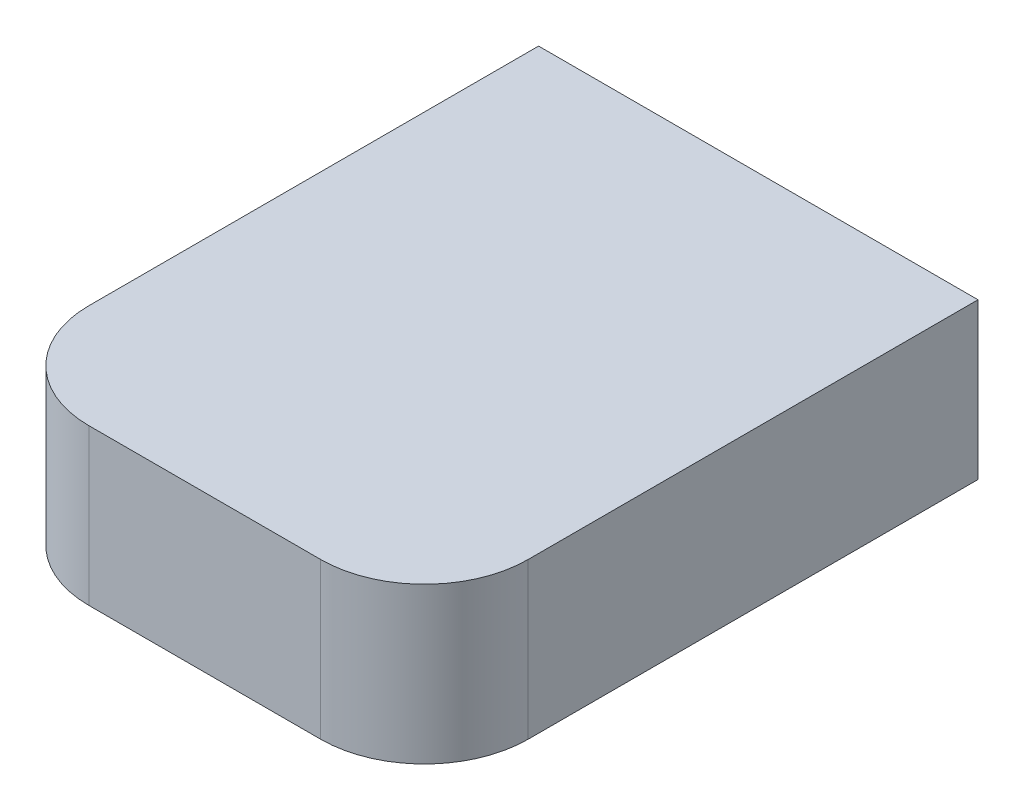
ISO-10303-21;
HEADER;
FILE_DESCRIPTION(('STEP AP214'),'2;1');
FILE_NAME('part.step','',(''),(''),'','','');
FILE_SCHEMA(('AUTOMOTIVE_DESIGN { 1 0 10303 214 1 1 1 1 }'));
ENDSEC;
DATA;
#1=APPLICATION_CONTEXT('core data for automotive mechanical design processes');
#2=APPLICATION_PROTOCOL_DEFINITION('international standard','automotive_design',2000,#1);
#3=PRODUCT_CONTEXT('',#1,'mechanical');
#4=PRODUCT('Part','Part','',(#3));
#5=PRODUCT_RELATED_PRODUCT_CATEGORY('part','',(#4));
#6=PRODUCT_DEFINITION_FORMATION('','',#4);
#7=PRODUCT_DEFINITION_CONTEXT('part definition',#1,'design');
#8=PRODUCT_DEFINITION('design','',#6,#7);
#9=PRODUCT_DEFINITION_SHAPE('','',#8);
#10=(LENGTH_UNIT() NAMED_UNIT(*) SI_UNIT(.MILLI.,.METRE.));
#11=(NAMED_UNIT(*) PLANE_ANGLE_UNIT() SI_UNIT($,.RADIAN.));
#12=(NAMED_UNIT(*) SI_UNIT($,.STERADIAN.) SOLID_ANGLE_UNIT());
#13=UNCERTAINTY_MEASURE_WITH_UNIT(LENGTH_MEASURE(1.E-05),#10,'distance_accuracy_value','');
#14=(GEOMETRIC_REPRESENTATION_CONTEXT(3) GLOBAL_UNCERTAINTY_ASSIGNED_CONTEXT((#13)) GLOBAL_UNIT_ASSIGNED_CONTEXT((#10,
#11,#12)) REPRESENTATION_CONTEXT('',''));
#15=CARTESIAN_POINT('',(0.,0.,0.));
#16=DIRECTION('',(0.,0.,1.));
#17=DIRECTION('',(1.,0.,0.));
#18=AXIS2_PLACEMENT_3D('',#15,#16,#17);
#19=CARTESIAN_POINT('',(129.05,-4.5,16.));
#20=DIRECTION('',(-1.,0.,0.));
#21=DIRECTION('',(0.,0.,1.));
#22=AXIS2_PLACEMENT_3D('',#19,#20,#21);
#23=PLANE('',#22);
#24=DIRECTION('',(0.,0.,-1.));
#25=VECTOR('',#24,1.);
#26=CARTESIAN_POINT('',(129.05,0.,16.));
#27=LINE('',#26,#25);
#28=CARTESIAN_POINT('',(129.05,0.,13.));
#29=VERTEX_POINT('',#28);
#30=CARTESIAN_POINT('',(129.05,0.,0.));
#31=VERTEX_POINT('',#30);
#32=EDGE_CURVE('E84',#29,#31,#27,.T.);
#33=ORIENTED_EDGE('',*,*,#32,.F.);
#34=DIRECTION('',(0.,1.,0.));
#35=VECTOR('',#34,1.);
#36=CARTESIAN_POINT('',(129.05,-4.5,13.));
#37=LINE('',#36,#35);
#38=CARTESIAN_POINT('',(129.05,-4.5,13.));
#39=VERTEX_POINT('',#38);
#40=EDGE_CURVE('E124',#29,#39,#37,.F.);
#41=ORIENTED_EDGE('',*,*,#40,.T.);
#42=DIRECTION('',(0.,0.,-1.));
#43=VECTOR('',#42,1.);
#44=CARTESIAN_POINT('',(129.05,-4.5,16.));
#45=LINE('',#44,#43);
#46=CARTESIAN_POINT('',(129.05,-4.5,0.));
#47=VERTEX_POINT('',#46);
#48=EDGE_CURVE('E106',#39,#47,#45,.T.);
#49=ORIENTED_EDGE('',*,*,#48,.T.);
#50=DIRECTION('',(0.,1.,0.));
#51=VECTOR('',#50,1.);
#52=CARTESIAN_POINT('',(129.05,-4.5,0.));
#53=LINE('',#52,#51);
#54=EDGE_CURVE('E101',#47,#31,#53,.T.);
#55=ORIENTED_EDGE('',*,*,#54,.T.);
#56=EDGE_LOOP('',(#33,#41,#49,#55));
#57=FACE_BOUND('',#56,.T.);
#58=ADVANCED_FACE('F33',(#57),#23,.F.);
#59=CARTESIAN_POINT('',(129.05,0.,16.));
#60=DIRECTION('',(0.,-1.,0.));
#61=DIRECTION('',(1.,0.,0.));
#62=AXIS2_PLACEMENT_3D('',#59,#60,#61);
#63=PLANE('',#62);
#64=DIRECTION('',(0.,0.,-1.));
#65=VECTOR('',#64,1.);
#66=CARTESIAN_POINT('',(116.35,0.,16.));
#67=LINE('',#66,#65);
#68=CARTESIAN_POINT('',(116.35,0.,13.));
#69=VERTEX_POINT('',#68);
#70=CARTESIAN_POINT('',(116.35,0.,0.));
#71=VERTEX_POINT('',#70);
#72=EDGE_CURVE('E95',#69,#71,#67,.T.);
#73=ORIENTED_EDGE('',*,*,#72,.F.);
#74=CARTESIAN_POINT('',(119.35,0.,13.));
#75=DIRECTION('',(0.,-1.,0.));
#76=DIRECTION('',(1.,0.,0.));
#77=AXIS2_PLACEMENT_3D('',#74,#75,#76);
#78=CIRCLE('',#77,3.);
#79=CARTESIAN_POINT('',(119.35,0.,16.));
#80=VERTEX_POINT('',#79);
#81=EDGE_CURVE('E11',#69,#80,#78,.F.);
#82=ORIENTED_EDGE('',*,*,#81,.T.);
#83=DIRECTION('',(-1.,0.,0.));
#84=VECTOR('',#83,1.);
#85=CARTESIAN_POINT('',(129.05,0.,16.));
#86=LINE('',#85,#84);
#87=CARTESIAN_POINT('',(126.05,0.,16.));
#88=VERTEX_POINT('',#87);
#89=EDGE_CURVE('E116',#88,#80,#86,.T.);
#90=ORIENTED_EDGE('',*,*,#89,.F.);
#91=CARTESIAN_POINT('',(126.05,0.,13.));
#92=DIRECTION('',(0.,-1.,0.));
#93=DIRECTION('',(1.,0.,0.));
#94=AXIS2_PLACEMENT_3D('',#91,#92,#93);
#95=CIRCLE('',#94,3.);
#96=EDGE_CURVE('E90',#88,#29,#95,.F.);
#97=ORIENTED_EDGE('',*,*,#96,.T.);
#98=ORIENTED_EDGE('',*,*,#32,.T.);
#99=DIRECTION('',(-1.,0.,0.));
#100=VECTOR('',#99,1.);
#101=CARTESIAN_POINT('',(129.05,0.,0.));
#102=LINE('',#101,#100);
#103=EDGE_CURVE('E87',#31,#71,#102,.T.);
#104=ORIENTED_EDGE('',*,*,#103,.T.);
#105=EDGE_LOOP('',(#73,#82,#90,#97,#98,#104));
#106=FACE_BOUND('',#105,.T.);
#107=ADVANCED_FACE('F86',(#106),#63,.F.);
#108=CARTESIAN_POINT('',(116.35,-4.5,16.));
#109=DIRECTION('',(1.,0.,0.));
#110=DIRECTION('',(0.,0.,-1.));
#111=AXIS2_PLACEMENT_3D('',#108,#109,#110);
#112=PLANE('',#111);
#113=DIRECTION('',(0.,0.,-1.));
#114=VECTOR('',#113,1.);
#115=CARTESIAN_POINT('',(116.35,-4.5,16.));
#116=LINE('',#115,#114);
#117=CARTESIAN_POINT('',(116.35,-4.5,13.));
#118=VERTEX_POINT('',#117);
#119=CARTESIAN_POINT('',(116.35,-4.5,0.));
#120=VERTEX_POINT('',#119);
#121=EDGE_CURVE('E118',#118,#120,#116,.T.);
#122=ORIENTED_EDGE('',*,*,#121,.F.);
#123=DIRECTION('',(0.,-1.,0.));
#124=VECTOR('',#123,1.);
#125=CARTESIAN_POINT('',(116.35,0.,13.));
#126=LINE('',#125,#124);
#127=EDGE_CURVE('E41',#118,#69,#126,.F.);
#128=ORIENTED_EDGE('',*,*,#127,.T.);
#129=ORIENTED_EDGE('',*,*,#72,.T.);
#130=DIRECTION('',(0.,-1.,0.));
#131=VECTOR('',#130,1.);
#132=CARTESIAN_POINT('',(116.35,-4.5,0.));
#133=LINE('',#132,#131);
#134=EDGE_CURVE('E103',#71,#120,#133,.T.);
#135=ORIENTED_EDGE('',*,*,#134,.T.);
#136=EDGE_LOOP('',(#122,#128,#129,#135));
#137=FACE_BOUND('',#136,.T.);
#138=ADVANCED_FACE('F152',(#137),#112,.F.);
#139=CARTESIAN_POINT('',(129.05,-4.5,16.));
#140=DIRECTION('',(0.,1.,0.));
#141=DIRECTION('',(-1.,0.,0.));
#142=AXIS2_PLACEMENT_3D('',#139,#140,#141);
#143=PLANE('',#142);
#144=DIRECTION('',(1.,0.,0.));
#145=VECTOR('',#144,1.);
#146=CARTESIAN_POINT('',(129.05,-4.5,16.));
#147=LINE('',#146,#145);
#148=CARTESIAN_POINT('',(119.35,-4.5,16.));
#149=VERTEX_POINT('',#148);
#150=CARTESIAN_POINT('',(126.05,-4.5,16.));
#151=VERTEX_POINT('',#150);
#152=EDGE_CURVE('E110',#149,#151,#147,.T.);
#153=ORIENTED_EDGE('',*,*,#152,.F.);
#154=CARTESIAN_POINT('',(119.35,-4.5,13.));
#155=DIRECTION('',(0.,1.,0.));
#156=DIRECTION('',(-1.,0.,0.));
#157=AXIS2_PLACEMENT_3D('',#154,#155,#156);
#158=CIRCLE('',#157,3.);
#159=EDGE_CURVE('E55',#149,#118,#158,.F.);
#160=ORIENTED_EDGE('',*,*,#159,.T.);
#161=ORIENTED_EDGE('',*,*,#121,.T.);
#162=DIRECTION('',(1.,0.,0.));
#163=VECTOR('',#162,1.);
#164=CARTESIAN_POINT('',(129.05,-4.5,0.));
#165=LINE('',#164,#163);
#166=EDGE_CURVE('E114',#120,#47,#165,.T.);
#167=ORIENTED_EDGE('',*,*,#166,.T.);
#168=ORIENTED_EDGE('',*,*,#48,.F.);
#169=CARTESIAN_POINT('',(126.05,-4.5,13.));
#170=DIRECTION('',(0.,1.,0.));
#171=DIRECTION('',(-1.,0.,0.));
#172=AXIS2_PLACEMENT_3D('',#169,#170,#171);
#173=CIRCLE('',#172,3.);
#174=EDGE_CURVE('E126',#39,#151,#173,.F.);
#175=ORIENTED_EDGE('',*,*,#174,.T.);
#176=EDGE_LOOP('',(#153,#160,#161,#167,#168,#175));
#177=FACE_BOUND('',#176,.T.);
#178=ADVANCED_FACE('F138',(#177),#143,.F.);
#179=CARTESIAN_POINT('',(0.,0.,16.));
#180=DIRECTION('',(0.,0.,1.));
#181=DIRECTION('',(1.,0.,0.));
#182=AXIS2_PLACEMENT_3D('',#179,#180,#181);
#183=PLANE('',#182);
#184=ORIENTED_EDGE('',*,*,#89,.T.);
#185=DIRECTION('',(0.,-1.,0.));
#186=VECTOR('',#185,1.);
#187=CARTESIAN_POINT('',(119.35,-4.5,16.));
#188=LINE('',#187,#186);
#189=EDGE_CURVE('E129',#80,#149,#188,.T.);
#190=ORIENTED_EDGE('',*,*,#189,.T.);
#191=ORIENTED_EDGE('',*,*,#152,.T.);
#192=DIRECTION('',(0.,1.,0.));
#193=VECTOR('',#192,1.);
#194=CARTESIAN_POINT('',(126.05,0.,16.));
#195=LINE('',#194,#193);
#196=EDGE_CURVE('E94',#151,#88,#195,.T.);
#197=ORIENTED_EDGE('',*,*,#196,.T.);
#198=EDGE_LOOP('',(#184,#190,#191,#197));
#199=FACE_BOUND('',#198,.T.);
#200=ADVANCED_FACE('F135',(#199),#183,.T.);
#201=CARTESIAN_POINT('',(0.,0.,0.));
#202=DIRECTION('',(0.,0.,1.));
#203=DIRECTION('',(1.,0.,0.));
#204=AXIS2_PLACEMENT_3D('',#201,#202,#203);
#205=PLANE('',#204);
#206=ORIENTED_EDGE('',*,*,#54,.F.);
#207=ORIENTED_EDGE('',*,*,#166,.F.);
#208=ORIENTED_EDGE('',*,*,#134,.F.);
#209=ORIENTED_EDGE('',*,*,#103,.F.);
#210=EDGE_LOOP('',(#206,#207,#208,#209));
#211=FACE_BOUND('',#210,.T.);
#212=ADVANCED_FACE('F99',(#211),#205,.F.);
#213=CARTESIAN_POINT('',(126.05,0.,13.));
#214=DIRECTION('',(0.,-1.,0.));
#215=DIRECTION('',(0.,0.,-1.));
#216=AXIS2_PLACEMENT_3D('',#213,#214,#215);
#217=CYLINDRICAL_SURFACE('',#216,3.);
#218=ORIENTED_EDGE('',*,*,#174,.F.);
#219=ORIENTED_EDGE('',*,*,#40,.F.);
#220=ORIENTED_EDGE('',*,*,#96,.F.);
#221=ORIENTED_EDGE('',*,*,#196,.F.);
#222=EDGE_LOOP('',(#218,#219,#220,#221));
#223=FACE_BOUND('',#222,.T.);
#224=ADVANCED_FACE('F142',(#223),#217,.T.);
#225=CARTESIAN_POINT('',(119.35,0.,13.));
#226=DIRECTION('',(0.,1.,0.));
#227=DIRECTION('',(0.,0.,1.));
#228=AXIS2_PLACEMENT_3D('',#225,#226,#227);
#229=CYLINDRICAL_SURFACE('',#228,3.);
#230=ORIENTED_EDGE('',*,*,#81,.F.);
#231=ORIENTED_EDGE('',*,*,#127,.F.);
#232=ORIENTED_EDGE('',*,*,#159,.F.);
#233=ORIENTED_EDGE('',*,*,#189,.F.);
#234=EDGE_LOOP('',(#230,#231,#232,#233));
#235=FACE_BOUND('',#234,.T.);
#236=ADVANCED_FACE('F35',(#235),#229,.T.);
#237=CLOSED_SHELL('',(#58,#107,#138,#178,#200,#212,#224,#236));
#238=MANIFOLD_SOLID_BREP('B2',#237);
#239=ADVANCED_BREP_SHAPE_REPRESENTATION('',(#18,#238),#14);
#240=SHAPE_DEFINITION_REPRESENTATION(#9,#239);
ENDSEC;
END-ISO-10303-21;
